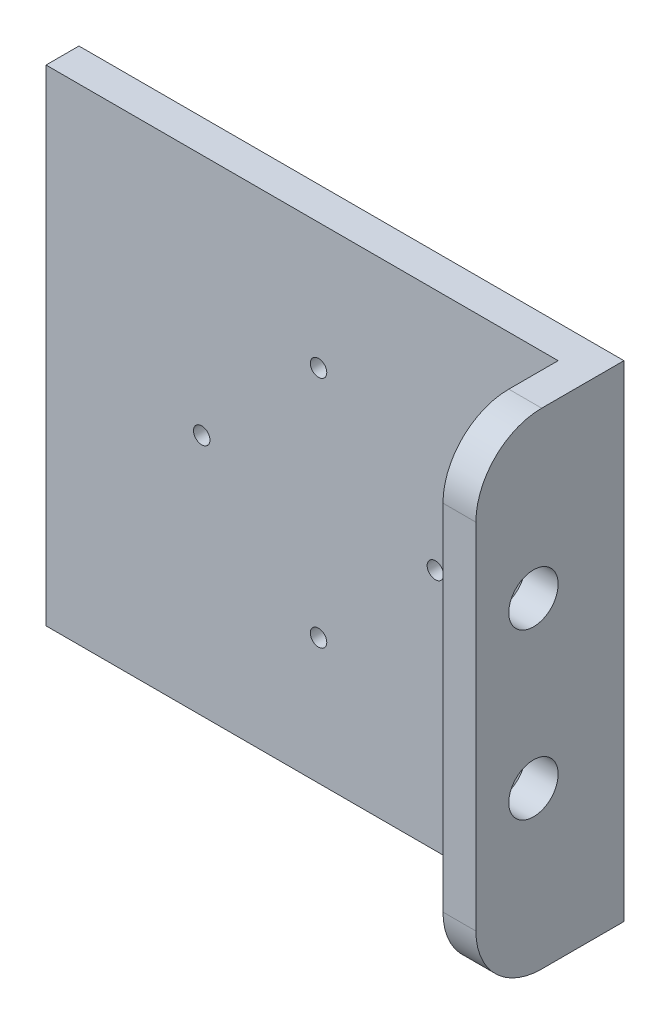
ISO-10303-21;
HEADER;
FILE_DESCRIPTION(('STEP AP214'),'2;1');
FILE_NAME('part.step','',(''),(''),'','','');
FILE_SCHEMA(('AUTOMOTIVE_DESIGN { 1 0 10303 214 1 1 1 1 }'));
ENDSEC;
DATA;
#1=APPLICATION_CONTEXT('core data for automotive mechanical design processes');
#2=APPLICATION_PROTOCOL_DEFINITION('international standard','automotive_design',2000,#1);
#3=PRODUCT_CONTEXT('',#1,'mechanical');
#4=PRODUCT('Part','Part','',(#3));
#5=PRODUCT_RELATED_PRODUCT_CATEGORY('part','',(#4));
#6=PRODUCT_DEFINITION_FORMATION('','',#4);
#7=PRODUCT_DEFINITION_CONTEXT('part definition',#1,'design');
#8=PRODUCT_DEFINITION('design','',#6,#7);
#9=PRODUCT_DEFINITION_SHAPE('','',#8);
#10=(LENGTH_UNIT() NAMED_UNIT(*) SI_UNIT(.MILLI.,.METRE.));
#11=(NAMED_UNIT(*) PLANE_ANGLE_UNIT() SI_UNIT($,.RADIAN.));
#12=(NAMED_UNIT(*) SI_UNIT($,.STERADIAN.) SOLID_ANGLE_UNIT());
#13=UNCERTAINTY_MEASURE_WITH_UNIT(LENGTH_MEASURE(1.E-05),#10,'distance_accuracy_value','');
#14=(GEOMETRIC_REPRESENTATION_CONTEXT(3) GLOBAL_UNCERTAINTY_ASSIGNED_CONTEXT((#13)) GLOBAL_UNIT_ASSIGNED_CONTEXT((#10,
#11,#12)) REPRESENTATION_CONTEXT('',''));
#15=CARTESIAN_POINT('',(0.,0.,0.));
#16=DIRECTION('',(0.,0.,1.));
#17=DIRECTION('',(1.,0.,0.));
#18=AXIS2_PLACEMENT_3D('',#15,#16,#17);
#19=CARTESIAN_POINT('',(0.,0.,2.));
#20=DIRECTION('',(0.,0.,1.));
#21=DIRECTION('',(1.,0.,0.));
#22=AXIS2_PLACEMENT_3D('',#19,#20,#21);
#23=PLANE('',#22);
#24=DIRECTION('',(0.,-1.,0.));
#25=VECTOR('',#24,1.);
#26=CARTESIAN_POINT('',(14.5620855842881,0.,2.));
#27=LINE('',#26,#25);
#28=CARTESIAN_POINT('',(14.5620855842881,14.7609243335695,2.));
#29=VERTEX_POINT('',#28);
#30=CARTESIAN_POINT('',(14.5620855842881,-14.7609243335695,2.));
#31=VERTEX_POINT('',#30);
#32=EDGE_CURVE('E56',#29,#31,#27,.T.);
#33=ORIENTED_EDGE('',*,*,#32,.F.);
#34=DIRECTION('',(-1.,0.,0.));
#35=VECTOR('',#34,1.);
#36=CARTESIAN_POINT('',(-16.5620855842881,14.7609243335695,2.));
#37=LINE('',#36,#35);
#38=CARTESIAN_POINT('',(-16.5620855842881,14.7609243335695,2.));
#39=VERTEX_POINT('',#38);
#40=EDGE_CURVE('E110',#29,#39,#37,.T.);
#41=ORIENTED_EDGE('',*,*,#40,.T.);
#42=DIRECTION('',(0.,-1.,0.));
#43=VECTOR('',#42,1.);
#44=CARTESIAN_POINT('',(-16.5620855842881,14.7609243335695,2.));
#45=LINE('',#44,#43);
#46=CARTESIAN_POINT('',(-16.5620855842881,-14.7609243335695,2.));
#47=VERTEX_POINT('',#46);
#48=EDGE_CURVE('E177',#39,#47,#45,.T.);
#49=ORIENTED_EDGE('',*,*,#48,.T.);
#50=DIRECTION('',(1.,0.,0.));
#51=VECTOR('',#50,1.);
#52=CARTESIAN_POINT('',(-16.5620855842881,-14.7609243335695,2.));
#53=LINE('',#52,#51);
#54=EDGE_CURVE('E61',#47,#31,#53,.T.);
#55=ORIENTED_EDGE('',*,*,#54,.T.);
#56=EDGE_LOOP('',(#33,#41,#49,#55));
#57=FACE_BOUND('',#56,.T.);
#58=CARTESIAN_POINT('',(-1.21087330378232E-12,-7.09999999999982,2.));
#59=DIRECTION('',(0.,0.,1.));
#60=DIRECTION('',(1.,0.,0.));
#61=AXIS2_PLACEMENT_3D('',#58,#59,#60);
#62=CIRCLE('',#61,0.500000000000003);
#63=CARTESIAN_POINT('',(0.499999999998792,-7.09999999999982,2.));
#64=VERTEX_POINT('',#63);
#65=EDGE_CURVE('E158',#64,#64,#62,.T.);
#66=ORIENTED_EDGE('',*,*,#65,.F.);
#67=EDGE_LOOP('',(#66));
#68=FACE_BOUND('',#67,.T.);
#69=CARTESIAN_POINT('',(0.,7.1,2.));
#70=DIRECTION('',(0.,0.,1.));
#71=DIRECTION('',(1.,0.,0.));
#72=AXIS2_PLACEMENT_3D('',#69,#70,#71);
#73=CIRCLE('',#72,0.499999999999998);
#74=CARTESIAN_POINT('',(0.499999999999999,7.1,2.));
#75=VERTEX_POINT('',#74);
#76=EDGE_CURVE('E170',#75,#75,#73,.T.);
#77=ORIENTED_EDGE('',*,*,#76,.F.);
#78=EDGE_LOOP('',(#77));
#79=FACE_BOUND('',#78,.T.);
#80=CARTESIAN_POINT('',(7.09999999999931,-5.15467182826682E-13,2.));
#81=DIRECTION('',(0.,0.,1.));
#82=DIRECTION('',(1.,0.,0.));
#83=AXIS2_PLACEMENT_3D('',#80,#81,#82);
#84=CIRCLE('',#83,0.499999999999999);
#85=CARTESIAN_POINT('',(7.59999999999931,-5.15467182826682E-13,2.));
#86=VERTEX_POINT('',#85);
#87=EDGE_CURVE('E164',#86,#86,#84,.T.);
#88=ORIENTED_EDGE('',*,*,#87,.F.);
#89=EDGE_LOOP('',(#88));
#90=FACE_BOUND('',#89,.T.);
#91=CARTESIAN_POINT('',(-7.10000000000051,6.96743648576852E-13,2.));
#92=DIRECTION('',(0.,0.,1.));
#93=DIRECTION('',(1.,0.,0.));
#94=AXIS2_PLACEMENT_3D('',#91,#92,#93);
#95=CIRCLE('',#94,0.500000000000001);
#96=CARTESIAN_POINT('',(-6.60000000000051,6.96743648576852E-13,2.));
#97=VERTEX_POINT('',#96);
#98=EDGE_CURVE('E152',#97,#97,#95,.T.);
#99=ORIENTED_EDGE('',*,*,#98,.F.);
#100=EDGE_LOOP('',(#99));
#101=FACE_BOUND('',#100,.T.);
#102=ADVANCED_FACE('F39',(#57,#68,#79,#90,#101),#23,.T.);
#103=CARTESIAN_POINT('',(0.,0.,0.));
#104=DIRECTION('',(0.,0.,1.));
#105=DIRECTION('',(1.,0.,0.));
#106=AXIS2_PLACEMENT_3D('',#103,#104,#105);
#107=PLANE('',#106);
#108=DIRECTION('',(0.,-1.,0.));
#109=VECTOR('',#108,1.);
#110=CARTESIAN_POINT('',(-16.5620855842881,14.7609243335695,0.));
#111=LINE('',#110,#109);
#112=CARTESIAN_POINT('',(-16.5620855842881,14.7609243335695,0.));
#113=VERTEX_POINT('',#112);
#114=CARTESIAN_POINT('',(-16.5620855842881,-14.7609243335695,0.));
#115=VERTEX_POINT('',#114);
#116=EDGE_CURVE('E186',#113,#115,#111,.T.);
#117=ORIENTED_EDGE('',*,*,#116,.F.);
#118=DIRECTION('',(-1.,0.,0.));
#119=VECTOR('',#118,1.);
#120=CARTESIAN_POINT('',(-16.5620855842881,14.7609243335695,0.));
#121=LINE('',#120,#119);
#122=CARTESIAN_POINT('',(16.5620855842881,14.7609243335695,0.));
#123=VERTEX_POINT('',#122);
#124=EDGE_CURVE('E184',#123,#113,#121,.T.);
#125=ORIENTED_EDGE('',*,*,#124,.F.);
#126=DIRECTION('',(0.,1.,0.));
#127=VECTOR('',#126,1.);
#128=CARTESIAN_POINT('',(16.5620855842881,14.7609243335695,0.));
#129=LINE('',#128,#127);
#130=CARTESIAN_POINT('',(16.5620855842881,-14.7609243335695,0.));
#131=VERTEX_POINT('',#130);
#132=EDGE_CURVE('E173',#131,#123,#129,.T.);
#133=ORIENTED_EDGE('',*,*,#132,.F.);
#134=DIRECTION('',(1.,0.,0.));
#135=VECTOR('',#134,1.);
#136=CARTESIAN_POINT('',(-16.5620855842881,-14.7609243335695,0.));
#137=LINE('',#136,#135);
#138=EDGE_CURVE('E178',#115,#131,#137,.T.);
#139=ORIENTED_EDGE('',*,*,#138,.F.);
#140=EDGE_LOOP('',(#117,#125,#133,#139));
#141=FACE_BOUND('',#140,.T.);
#142=CARTESIAN_POINT('',(0.,7.1,0.));
#143=DIRECTION('',(0.,0.,1.));
#144=DIRECTION('',(1.,0.,0.));
#145=AXIS2_PLACEMENT_3D('',#142,#143,#144);
#146=CIRCLE('',#145,0.499999999999998);
#147=CARTESIAN_POINT('',(0.499999999999999,7.1,0.));
#148=VERTEX_POINT('',#147);
#149=EDGE_CURVE('E167',#148,#148,#146,.T.);
#150=ORIENTED_EDGE('',*,*,#149,.T.);
#151=EDGE_LOOP('',(#150));
#152=FACE_BOUND('',#151,.T.);
#153=CARTESIAN_POINT('',(7.09999999999931,-5.15467182826682E-13,0.));
#154=DIRECTION('',(0.,0.,1.));
#155=DIRECTION('',(1.,0.,0.));
#156=AXIS2_PLACEMENT_3D('',#153,#154,#155);
#157=CIRCLE('',#156,0.499999999999999);
#158=CARTESIAN_POINT('',(7.59999999999931,-5.15467182826682E-13,0.));
#159=VERTEX_POINT('',#158);
#160=EDGE_CURVE('E161',#159,#159,#157,.T.);
#161=ORIENTED_EDGE('',*,*,#160,.T.);
#162=EDGE_LOOP('',(#161));
#163=FACE_BOUND('',#162,.T.);
#164=CARTESIAN_POINT('',(-1.21087330378232E-12,-7.09999999999982,0.));
#165=DIRECTION('',(0.,0.,1.));
#166=DIRECTION('',(1.,0.,0.));
#167=AXIS2_PLACEMENT_3D('',#164,#165,#166);
#168=CIRCLE('',#167,0.500000000000003);
#169=CARTESIAN_POINT('',(0.499999999998792,-7.09999999999982,0.));
#170=VERTEX_POINT('',#169);
#171=EDGE_CURVE('E155',#170,#170,#168,.T.);
#172=ORIENTED_EDGE('',*,*,#171,.T.);
#173=EDGE_LOOP('',(#172));
#174=FACE_BOUND('',#173,.T.);
#175=CARTESIAN_POINT('',(-7.10000000000051,6.96743648576852E-13,0.));
#176=DIRECTION('',(0.,0.,1.));
#177=DIRECTION('',(1.,0.,0.));
#178=AXIS2_PLACEMENT_3D('',#175,#176,#177);
#179=CIRCLE('',#178,0.500000000000001);
#180=CARTESIAN_POINT('',(-6.60000000000051,6.96743648576852E-13,0.));
#181=VERTEX_POINT('',#180);
#182=EDGE_CURVE('E151',#181,#181,#179,.T.);
#183=ORIENTED_EDGE('',*,*,#182,.T.);
#184=EDGE_LOOP('',(#183));
#185=FACE_BOUND('',#184,.T.);
#186=ADVANCED_FACE('F213',(#141,#152,#163,#174,#185),#107,.F.);
#187=CARTESIAN_POINT('',(16.5620855842881,14.7609243335695,2.));
#188=DIRECTION('',(-1.,0.,0.));
#189=DIRECTION('',(0.,0.,1.));
#190=AXIS2_PLACEMENT_3D('',#187,#188,#189);
#191=PLANE('',#190);
#192=CARTESIAN_POINT('',(16.5620855842881,-4.99999999999999,5.49999999999994));
#193=DIRECTION('',(1.,0.,0.));
#194=DIRECTION('',(0.,0.,-1.));
#195=AXIS2_PLACEMENT_3D('',#192,#193,#194);
#196=CIRCLE('',#195,1.5);
#197=CARTESIAN_POINT('',(16.5620855842881,-4.99999999999999,3.99999999999994));
#198=VERTEX_POINT('',#197);
#199=EDGE_CURVE('E197',#198,#198,#196,.T.);
#200=ORIENTED_EDGE('',*,*,#199,.F.);
#201=EDGE_LOOP('',(#200));
#202=FACE_BOUND('',#201,.T.);
#203=CARTESIAN_POINT('',(16.5620855842881,5.,5.49999999999995));
#204=DIRECTION('',(1.,0.,0.));
#205=DIRECTION('',(0.,0.,-1.));
#206=AXIS2_PLACEMENT_3D('',#203,#204,#205);
#207=CIRCLE('',#206,1.5);
#208=CARTESIAN_POINT('',(16.5620855842881,5.,3.99999999999995));
#209=VERTEX_POINT('',#208);
#210=EDGE_CURVE('E202',#209,#209,#207,.T.);
#211=ORIENTED_EDGE('',*,*,#210,.F.);
#212=EDGE_LOOP('',(#211));
#213=FACE_BOUND('',#212,.T.);
#214=ORIENTED_EDGE('',*,*,#132,.T.);
#215=DIRECTION('',(0.,0.,-1.));
#216=VECTOR('',#215,1.);
#217=CARTESIAN_POINT('',(16.5620855842881,14.7609243335695,2.));
#218=LINE('',#217,#216);
#219=CARTESIAN_POINT('',(16.5620855842881,14.7609243335695,5.));
#220=VERTEX_POINT('',#219);
#221=EDGE_CURVE('E11',#220,#123,#218,.T.);
#222=ORIENTED_EDGE('',*,*,#221,.F.);
#223=CARTESIAN_POINT('',(16.5620855842881,10.7609243335695,5.));
#224=DIRECTION('',(1.,0.,0.));
#225=DIRECTION('',(0.,0.,1.));
#226=AXIS2_PLACEMENT_3D('',#223,#224,#225);
#227=CIRCLE('',#226,4.);
#228=CARTESIAN_POINT('',(16.5620855842881,10.7609243335695,9.));
#229=VERTEX_POINT('',#228);
#230=EDGE_CURVE('E120',#220,#229,#227,.T.);
#231=ORIENTED_EDGE('',*,*,#230,.T.);
#232=DIRECTION('',(0.,-1.,0.));
#233=VECTOR('',#232,1.);
#234=CARTESIAN_POINT('',(16.5620855842881,-10.7609243335695,9.));
#235=LINE('',#234,#233);
#236=CARTESIAN_POINT('',(16.5620855842881,-10.7609243335695,9.));
#237=VERTEX_POINT('',#236);
#238=EDGE_CURVE('E139',#229,#237,#235,.T.);
#239=ORIENTED_EDGE('',*,*,#238,.T.);
#240=CARTESIAN_POINT('',(16.5620855842881,-10.7609243335695,5.));
#241=DIRECTION('',(1.,0.,0.));
#242=DIRECTION('',(0.,0.,1.));
#243=AXIS2_PLACEMENT_3D('',#240,#241,#242);
#244=CIRCLE('',#243,4.);
#245=CARTESIAN_POINT('',(16.5620855842881,-14.7609243335695,5.));
#246=VERTEX_POINT('',#245);
#247=EDGE_CURVE('E114',#237,#246,#244,.T.);
#248=ORIENTED_EDGE('',*,*,#247,.T.);
#249=DIRECTION('',(0.,0.,-1.));
#250=VECTOR('',#249,1.);
#251=CARTESIAN_POINT('',(16.5620855842881,-14.7609243335695,2.));
#252=LINE('',#251,#250);
#253=EDGE_CURVE('E181',#246,#131,#252,.T.);
#254=ORIENTED_EDGE('',*,*,#253,.T.);
#255=EDGE_LOOP('',(#214,#222,#231,#239,#248,#254));
#256=FACE_BOUND('',#255,.T.);
#257=ADVANCED_FACE('F41',(#202,#213,#256),#191,.F.);
#258=CARTESIAN_POINT('',(-16.5620855842881,14.7609243335695,2.));
#259=DIRECTION('',(0.,-1.,0.));
#260=DIRECTION('',(0.,0.,-1.));
#261=AXIS2_PLACEMENT_3D('',#258,#259,#260);
#262=PLANE('',#261);
#263=ORIENTED_EDGE('',*,*,#40,.F.);
#264=DIRECTION('',(0.,0.,1.));
#265=VECTOR('',#264,1.);
#266=CARTESIAN_POINT('',(14.5620855842881,14.7609243335695,5.));
#267=LINE('',#266,#265);
#268=CARTESIAN_POINT('',(14.5620855842881,14.7609243335695,5.));
#269=VERTEX_POINT('',#268);
#270=EDGE_CURVE('E104',#29,#269,#267,.T.);
#271=ORIENTED_EDGE('',*,*,#270,.T.);
#272=DIRECTION('',(1.,0.,0.));
#273=VECTOR('',#272,1.);
#274=CARTESIAN_POINT('',(14.5620855842881,14.7609243335695,5.));
#275=LINE('',#274,#273);
#276=EDGE_CURVE('E107',#269,#220,#275,.T.);
#277=ORIENTED_EDGE('',*,*,#276,.T.);
#278=ORIENTED_EDGE('',*,*,#221,.T.);
#279=ORIENTED_EDGE('',*,*,#124,.T.);
#280=DIRECTION('',(0.,0.,-1.));
#281=VECTOR('',#280,1.);
#282=CARTESIAN_POINT('',(-16.5620855842881,14.7609243335695,2.));
#283=LINE('',#282,#281);
#284=EDGE_CURVE('E48',#39,#113,#283,.T.);
#285=ORIENTED_EDGE('',*,*,#284,.F.);
#286=EDGE_LOOP('',(#263,#271,#277,#278,#279,#285));
#287=FACE_BOUND('',#286,.T.);
#288=ADVANCED_FACE('F106',(#287),#262,.F.);
#289=CARTESIAN_POINT('',(-16.5620855842881,14.7609243335695,2.));
#290=DIRECTION('',(1.,0.,0.));
#291=DIRECTION('',(0.,0.,-1.));
#292=AXIS2_PLACEMENT_3D('',#289,#290,#291);
#293=PLANE('',#292);
#294=ORIENTED_EDGE('',*,*,#116,.T.);
#295=DIRECTION('',(0.,0.,-1.));
#296=VECTOR('',#295,1.);
#297=CARTESIAN_POINT('',(-16.5620855842881,-14.7609243335695,2.));
#298=LINE('',#297,#296);
#299=EDGE_CURVE('E191',#47,#115,#298,.T.);
#300=ORIENTED_EDGE('',*,*,#299,.F.);
#301=ORIENTED_EDGE('',*,*,#48,.F.);
#302=ORIENTED_EDGE('',*,*,#284,.T.);
#303=EDGE_LOOP('',(#294,#300,#301,#302));
#304=FACE_BOUND('',#303,.T.);
#305=ADVANCED_FACE('F222',(#304),#293,.F.);
#306=CARTESIAN_POINT('',(-16.5620855842881,-14.7609243335695,2.));
#307=DIRECTION('',(0.,1.,0.));
#308=DIRECTION('',(0.,0.,1.));
#309=AXIS2_PLACEMENT_3D('',#306,#307,#308);
#310=PLANE('',#309);
#311=ORIENTED_EDGE('',*,*,#138,.T.);
#312=ORIENTED_EDGE('',*,*,#253,.F.);
#313=DIRECTION('',(1.,0.,0.));
#314=VECTOR('',#313,1.);
#315=CARTESIAN_POINT('',(14.5620855842881,-14.7609243335695,5.));
#316=LINE('',#315,#314);
#317=CARTESIAN_POINT('',(14.5620855842881,-14.7609243335695,5.));
#318=VERTEX_POINT('',#317);
#319=EDGE_CURVE('E144',#318,#246,#316,.T.);
#320=ORIENTED_EDGE('',*,*,#319,.F.);
#321=DIRECTION('',(0.,0.,-1.));
#322=VECTOR('',#321,1.);
#323=CARTESIAN_POINT('',(14.5620855842881,-14.7609243335695,5.));
#324=LINE('',#323,#322);
#325=EDGE_CURVE('E122',#318,#31,#324,.T.);
#326=ORIENTED_EDGE('',*,*,#325,.T.);
#327=ORIENTED_EDGE('',*,*,#54,.F.);
#328=ORIENTED_EDGE('',*,*,#299,.T.);
#329=EDGE_LOOP('',(#311,#312,#320,#326,#327,#328));
#330=FACE_BOUND('',#329,.T.);
#331=ADVANCED_FACE('F249',(#330),#310,.F.);
#332=CARTESIAN_POINT('',(0.,7.1,2.));
#333=DIRECTION('',(0.,0.,-1.));
#334=DIRECTION('',(-1.,0.,0.));
#335=AXIS2_PLACEMENT_3D('',#332,#333,#334);
#336=CYLINDRICAL_SURFACE('',#335,0.499999999999998);
#337=ORIENTED_EDGE('',*,*,#76,.T.);
#338=EDGE_LOOP('',(#337));
#339=FACE_BOUND('',#338,.T.);
#340=ORIENTED_EDGE('',*,*,#149,.F.);
#341=EDGE_LOOP('',(#340));
#342=FACE_BOUND('',#341,.T.);
#343=ADVANCED_FACE('F252',(#339,#342),#336,.F.);
#344=CARTESIAN_POINT('',(7.09999999999931,-5.15467182826682E-13,2.));
#345=DIRECTION('',(0.,0.,-1.));
#346=DIRECTION('',(-1.,0.,0.));
#347=AXIS2_PLACEMENT_3D('',#344,#345,#346);
#348=CYLINDRICAL_SURFACE('',#347,0.499999999999999);
#349=ORIENTED_EDGE('',*,*,#87,.T.);
#350=EDGE_LOOP('',(#349));
#351=FACE_BOUND('',#350,.T.);
#352=ORIENTED_EDGE('',*,*,#160,.F.);
#353=EDGE_LOOP('',(#352));
#354=FACE_BOUND('',#353,.T.);
#355=ADVANCED_FACE('F275',(#351,#354),#348,.F.);
#356=CARTESIAN_POINT('',(-1.21087330378232E-12,-7.09999999999982,2.));
#357=DIRECTION('',(0.,0.,-1.));
#358=DIRECTION('',(-1.,0.,0.));
#359=AXIS2_PLACEMENT_3D('',#356,#357,#358);
#360=CYLINDRICAL_SURFACE('',#359,0.500000000000003);
#361=ORIENTED_EDGE('',*,*,#65,.T.);
#362=EDGE_LOOP('',(#361));
#363=FACE_BOUND('',#362,.T.);
#364=ORIENTED_EDGE('',*,*,#171,.F.);
#365=EDGE_LOOP('',(#364));
#366=FACE_BOUND('',#365,.T.);
#367=ADVANCED_FACE('F239',(#363,#366),#360,.F.);
#368=CARTESIAN_POINT('',(-7.10000000000051,6.96743648576852E-13,2.));
#369=DIRECTION('',(0.,0.,-1.));
#370=DIRECTION('',(-1.,0.,0.));
#371=AXIS2_PLACEMENT_3D('',#368,#369,#370);
#372=CYLINDRICAL_SURFACE('',#371,0.500000000000001);
#373=ORIENTED_EDGE('',*,*,#98,.T.);
#374=EDGE_LOOP('',(#373));
#375=FACE_BOUND('',#374,.T.);
#376=ORIENTED_EDGE('',*,*,#182,.F.);
#377=EDGE_LOOP('',(#376));
#378=FACE_BOUND('',#377,.T.);
#379=ADVANCED_FACE('F235',(#375,#378),#372,.F.);
#380=CARTESIAN_POINT('',(14.5620855842881,-10.7609243335695,5.));
#381=DIRECTION('',(1.,0.,0.));
#382=DIRECTION('',(0.,0.,-1.));
#383=AXIS2_PLACEMENT_3D('',#380,#381,#382);
#384=CYLINDRICAL_SURFACE('',#383,4.);
#385=ORIENTED_EDGE('',*,*,#247,.F.);
#386=DIRECTION('',(1.,0.,0.));
#387=VECTOR('',#386,1.);
#388=CARTESIAN_POINT('',(14.5620855842881,-10.7609243335695,9.));
#389=LINE('',#388,#387);
#390=CARTESIAN_POINT('',(14.5620855842881,-10.7609243335695,9.));
#391=VERTEX_POINT('',#390);
#392=EDGE_CURVE('E147',#391,#237,#389,.T.);
#393=ORIENTED_EDGE('',*,*,#392,.F.);
#394=CARTESIAN_POINT('',(14.5620855842881,-10.7609243335695,5.));
#395=DIRECTION('',(1.,0.,0.));
#396=DIRECTION('',(0.,0.,1.));
#397=AXIS2_PLACEMENT_3D('',#394,#395,#396);
#398=CIRCLE('',#397,4.);
#399=EDGE_CURVE('E130',#391,#318,#398,.T.);
#400=ORIENTED_EDGE('',*,*,#399,.T.);
#401=ORIENTED_EDGE('',*,*,#319,.T.);
#402=EDGE_LOOP('',(#385,#393,#400,#401));
#403=FACE_BOUND('',#402,.T.);
#404=ADVANCED_FACE('F238',(#403),#384,.T.);
#405=CARTESIAN_POINT('',(14.5620855842881,-10.7609243335695,9.));
#406=DIRECTION('',(0.,0.,1.));
#407=DIRECTION('',(1.,0.,0.));
#408=AXIS2_PLACEMENT_3D('',#405,#406,#407);
#409=PLANE('',#408);
#410=ORIENTED_EDGE('',*,*,#238,.F.);
#411=DIRECTION('',(1.,0.,0.));
#412=VECTOR('',#411,1.);
#413=CARTESIAN_POINT('',(14.5620855842881,10.7609243335695,9.));
#414=LINE('',#413,#412);
#415=CARTESIAN_POINT('',(14.5620855842881,10.7609243335695,9.));
#416=VERTEX_POINT('',#415);
#417=EDGE_CURVE('E121',#416,#229,#414,.T.);
#418=ORIENTED_EDGE('',*,*,#417,.F.);
#419=DIRECTION('',(0.,-1.,0.));
#420=VECTOR('',#419,1.);
#421=CARTESIAN_POINT('',(14.5620855842881,-10.7609243335695,9.));
#422=LINE('',#421,#420);
#423=EDGE_CURVE('E128',#416,#391,#422,.T.);
#424=ORIENTED_EDGE('',*,*,#423,.T.);
#425=ORIENTED_EDGE('',*,*,#392,.T.);
#426=EDGE_LOOP('',(#410,#418,#424,#425));
#427=FACE_BOUND('',#426,.T.);
#428=ADVANCED_FACE('F300',(#427),#409,.T.);
#429=CARTESIAN_POINT('',(14.5620855842881,10.7609243335695,5.));
#430=DIRECTION('',(1.,0.,0.));
#431=DIRECTION('',(0.,0.,-1.));
#432=AXIS2_PLACEMENT_3D('',#429,#430,#431);
#433=CYLINDRICAL_SURFACE('',#432,4.);
#434=ORIENTED_EDGE('',*,*,#230,.F.);
#435=ORIENTED_EDGE('',*,*,#276,.F.);
#436=CARTESIAN_POINT('',(14.5620855842881,10.7609243335695,5.));
#437=DIRECTION('',(1.,0.,0.));
#438=DIRECTION('',(0.,0.,1.));
#439=AXIS2_PLACEMENT_3D('',#436,#437,#438);
#440=CIRCLE('',#439,4.);
#441=EDGE_CURVE('E113',#269,#416,#440,.T.);
#442=ORIENTED_EDGE('',*,*,#441,.T.);
#443=ORIENTED_EDGE('',*,*,#417,.T.);
#444=EDGE_LOOP('',(#434,#435,#442,#443));
#445=FACE_BOUND('',#444,.T.);
#446=ADVANCED_FACE('F118',(#445),#433,.T.);
#447=CARTESIAN_POINT('',(14.5620855842881,10.7609243335695,5.));
#448=DIRECTION('',(-1.,0.,0.));
#449=DIRECTION('',(0.,0.,1.));
#450=AXIS2_PLACEMENT_3D('',#447,#448,#449);
#451=PLANE('',#450);
#452=CARTESIAN_POINT('',(14.5620855842881,-4.99999999999999,5.49999999999994));
#453=DIRECTION('',(-1.,0.,0.));
#454=DIRECTION('',(0.,0.,1.));
#455=AXIS2_PLACEMENT_3D('',#452,#453,#454);
#456=CIRCLE('',#455,1.5);
#457=CARTESIAN_POINT('',(14.5620855842881,-4.99999999999999,6.99999999999994));
#458=VERTEX_POINT('',#457);
#459=EDGE_CURVE('E43',#458,#458,#456,.T.);
#460=ORIENTED_EDGE('',*,*,#459,.F.);
#461=EDGE_LOOP('',(#460));
#462=FACE_BOUND('',#461,.T.);
#463=CARTESIAN_POINT('',(14.5620855842881,5.,5.49999999999995));
#464=DIRECTION('',(-1.,0.,0.));
#465=DIRECTION('',(0.,0.,1.));
#466=AXIS2_PLACEMENT_3D('',#463,#464,#465);
#467=CIRCLE('',#466,1.5);
#468=CARTESIAN_POINT('',(14.5620855842881,5.,6.99999999999995));
#469=VERTEX_POINT('',#468);
#470=EDGE_CURVE('E195',#469,#469,#467,.T.);
#471=ORIENTED_EDGE('',*,*,#470,.F.);
#472=EDGE_LOOP('',(#471));
#473=FACE_BOUND('',#472,.T.);
#474=ORIENTED_EDGE('',*,*,#270,.F.);
#475=ORIENTED_EDGE('',*,*,#32,.T.);
#476=ORIENTED_EDGE('',*,*,#325,.F.);
#477=ORIENTED_EDGE('',*,*,#399,.F.);
#478=ORIENTED_EDGE('',*,*,#423,.F.);
#479=ORIENTED_EDGE('',*,*,#441,.F.);
#480=EDGE_LOOP('',(#474,#475,#476,#477,#478,#479));
#481=FACE_BOUND('',#480,.T.);
#482=ADVANCED_FACE('F125',(#462,#473,#481),#451,.T.);
#483=CARTESIAN_POINT('',(10.5620855842881,5.,5.49999999999995));
#484=DIRECTION('',(1.,0.,0.));
#485=DIRECTION('',(0.,0.,-1.));
#486=AXIS2_PLACEMENT_3D('',#483,#484,#485);
#487=CYLINDRICAL_SURFACE('',#486,1.5);
#488=ORIENTED_EDGE('',*,*,#470,.T.);
#489=EDGE_LOOP('',(#488));
#490=FACE_BOUND('',#489,.T.);
#491=ORIENTED_EDGE('',*,*,#210,.T.);
#492=EDGE_LOOP('',(#491));
#493=FACE_BOUND('',#492,.T.);
#494=ADVANCED_FACE('F209',(#490,#493),#487,.F.);
#495=CARTESIAN_POINT('',(10.5620855842881,-4.99999999999999,5.49999999999994));
#496=DIRECTION('',(1.,0.,0.));
#497=DIRECTION('',(0.,0.,-1.));
#498=AXIS2_PLACEMENT_3D('',#495,#496,#497);
#499=CYLINDRICAL_SURFACE('',#498,1.5);
#500=ORIENTED_EDGE('',*,*,#459,.T.);
#501=EDGE_LOOP('',(#500));
#502=FACE_BOUND('',#501,.T.);
#503=ORIENTED_EDGE('',*,*,#199,.T.);
#504=EDGE_LOOP('',(#503));
#505=FACE_BOUND('',#504,.T.);
#506=ADVANCED_FACE('F328',(#502,#505),#499,.F.);
#507=CLOSED_SHELL('',(#102,#186,#257,#288,#305,#331,#343,#355,#367,#379,#404,#428,#446,#482,
#494,#506));
#508=MANIFOLD_SOLID_BREP('B2',#507);
#509=ADVANCED_BREP_SHAPE_REPRESENTATION('',(#18,#508),#14);
#510=SHAPE_DEFINITION_REPRESENTATION(#9,#509);
ENDSEC;
END-ISO-10303-21;
